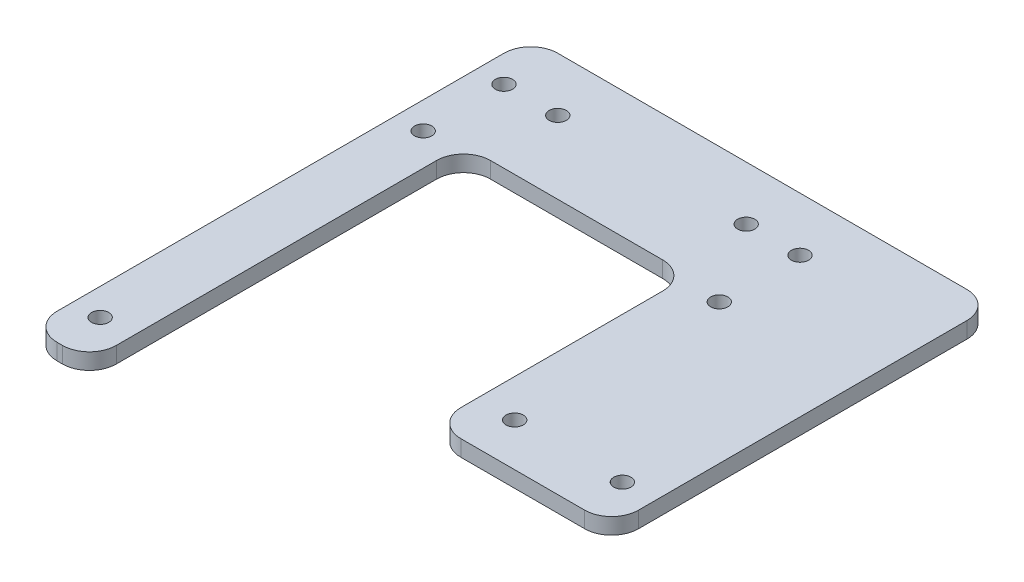
ISO-10303-21;
HEADER;
FILE_DESCRIPTION(('STEP AP214'),'2;1');
FILE_NAME('part.step','',(''),(''),'','','');
FILE_SCHEMA(('AUTOMOTIVE_DESIGN { 1 0 10303 214 1 1 1 1 }'));
ENDSEC;
DATA;
#1=APPLICATION_CONTEXT('core data for automotive mechanical design processes');
#2=APPLICATION_PROTOCOL_DEFINITION('international standard','automotive_design',2000,#1);
#3=PRODUCT_CONTEXT('',#1,'mechanical');
#4=PRODUCT('Part','Part','',(#3));
#5=PRODUCT_RELATED_PRODUCT_CATEGORY('part','',(#4));
#6=PRODUCT_DEFINITION_FORMATION('','',#4);
#7=PRODUCT_DEFINITION_CONTEXT('part definition',#1,'design');
#8=PRODUCT_DEFINITION('design','',#6,#7);
#9=PRODUCT_DEFINITION_SHAPE('','',#8);
#10=(LENGTH_UNIT() NAMED_UNIT(*) SI_UNIT(.MILLI.,.METRE.));
#11=(NAMED_UNIT(*) PLANE_ANGLE_UNIT() SI_UNIT($,.RADIAN.));
#12=(NAMED_UNIT(*) SI_UNIT($,.STERADIAN.) SOLID_ANGLE_UNIT());
#13=UNCERTAINTY_MEASURE_WITH_UNIT(LENGTH_MEASURE(1.E-05),#10,'distance_accuracy_value','');
#14=(GEOMETRIC_REPRESENTATION_CONTEXT(3) GLOBAL_UNCERTAINTY_ASSIGNED_CONTEXT((#13)) GLOBAL_UNIT_ASSIGNED_CONTEXT((#10,
#11,#12)) REPRESENTATION_CONTEXT('',''));
#15=CARTESIAN_POINT('',(0.,0.,0.));
#16=DIRECTION('',(0.,0.,1.));
#17=DIRECTION('',(1.,0.,0.));
#18=AXIS2_PLACEMENT_3D('',#15,#16,#17);
#19=CARTESIAN_POINT('',(-190.,10.,-194.));
#20=DIRECTION('',(0.,0.,1.));
#21=DIRECTION('',(1.,0.,0.));
#22=AXIS2_PLACEMENT_3D('',#19,#20,#21);
#23=PLANE('',#22);
#24=DIRECTION('',(-1.,0.,0.));
#25=VECTOR('',#24,1.);
#26=CARTESIAN_POINT('',(-190.,0.,-194.));
#27=LINE('',#26,#25);
#28=CARTESIAN_POINT('',(-184.,0.,-194.));
#29=VERTEX_POINT('',#28);
#30=CARTESIAN_POINT('',(-185.,0.,-194.));
#31=VERTEX_POINT('',#30);
#32=EDGE_CURVE('E307',#29,#31,#27,.T.);
#33=ORIENTED_EDGE('',*,*,#32,.F.);
#34=DIRECTION('',(0.,-1.,0.));
#35=VECTOR('',#34,1.);
#36=CARTESIAN_POINT('',(-184.,3.,-194.));
#37=LINE('',#36,#35);
#38=CARTESIAN_POINT('',(-184.,3.,-194.));
#39=VERTEX_POINT('',#38);
#40=EDGE_CURVE('E263',#29,#39,#37,.F.);
#41=ORIENTED_EDGE('',*,*,#40,.T.);
#42=DIRECTION('',(-1.,0.,0.));
#43=VECTOR('',#42,1.);
#44=CARTESIAN_POINT('',(0.,3.,-194.));
#45=LINE('',#44,#43);
#46=CARTESIAN_POINT('',(-185.,3.,-194.));
#47=VERTEX_POINT('',#46);
#48=EDGE_CURVE('E309',#39,#47,#45,.T.);
#49=ORIENTED_EDGE('',*,*,#48,.T.);
#50=DIRECTION('',(0.,-1.,0.));
#51=VECTOR('',#50,1.);
#52=CARTESIAN_POINT('',(-185.,0.,-194.));
#53=LINE('',#52,#51);
#54=EDGE_CURVE('E216',#47,#31,#53,.T.);
#55=ORIENTED_EDGE('',*,*,#54,.T.);
#56=EDGE_LOOP('',(#33,#41,#49,#55));
#57=FACE_BOUND('',#56,.T.);
#58=ADVANCED_FACE('F51',(#57),#23,.T.);
#59=CARTESIAN_POINT('',(-190.,3.,-287.));
#60=DIRECTION('',(1.,0.,0.));
#61=DIRECTION('',(0.,0.,-1.));
#62=AXIS2_PLACEMENT_3D('',#59,#60,#61);
#63=PLANE('',#62);
#64=DIRECTION('',(0.,0.,1.));
#65=VECTOR('',#64,1.);
#66=CARTESIAN_POINT('',(-190.,0.,-287.));
#67=LINE('',#66,#65);
#68=CARTESIAN_POINT('',(-190.,0.,-282.));
#69=VERTEX_POINT('',#68);
#70=CARTESIAN_POINT('',(-190.,0.,-199.));
#71=VERTEX_POINT('',#70);
#72=EDGE_CURVE('E178',#69,#71,#67,.T.);
#73=ORIENTED_EDGE('',*,*,#72,.T.);
#74=DIRECTION('',(0.,-1.,0.));
#75=VECTOR('',#74,1.);
#76=CARTESIAN_POINT('',(-190.,3.,-199.));
#77=LINE('',#76,#75);
#78=CARTESIAN_POINT('',(-190.,3.,-199.));
#79=VERTEX_POINT('',#78);
#80=EDGE_CURVE('E219',#71,#79,#77,.F.);
#81=ORIENTED_EDGE('',*,*,#80,.T.);
#82=DIRECTION('',(0.,0.,1.));
#83=VECTOR('',#82,1.);
#84=CARTESIAN_POINT('',(-190.,3.,0.));
#85=LINE('',#84,#83);
#86=CARTESIAN_POINT('',(-190.,3.,-282.));
#87=VERTEX_POINT('',#86);
#88=EDGE_CURVE('E181',#87,#79,#85,.T.);
#89=ORIENTED_EDGE('',*,*,#88,.F.);
#90=DIRECTION('',(0.,-1.,0.));
#91=VECTOR('',#90,1.);
#92=CARTESIAN_POINT('',(-190.,3.,-282.));
#93=LINE('',#92,#91);
#94=EDGE_CURVE('E168',#87,#69,#93,.T.);
#95=ORIENTED_EDGE('',*,*,#94,.T.);
#96=EDGE_LOOP('',(#73,#81,#89,#95));
#97=FACE_BOUND('',#96,.T.);
#98=ADVANCED_FACE('F177',(#97),#63,.F.);
#99=CARTESIAN_POINT('',(0.,3.,0.));
#100=DIRECTION('',(0.,-1.,0.));
#101=DIRECTION('',(0.,0.,-1.));
#102=AXIS2_PLACEMENT_3D('',#99,#100,#101);
#103=PLANE('',#102);
#104=CARTESIAN_POINT('',(-110.,3.,-224.));
#105=DIRECTION('',(0.,-1.,0.));
#106=DIRECTION('',(0.,0.,-1.));
#107=AXIS2_PLACEMENT_3D('',#104,#105,#106);
#108=CIRCLE('',#107,1.59999999999999);
#109=CARTESIAN_POINT('',(-110.,3.,-225.6));
#110=VERTEX_POINT('',#109);
#111=EDGE_CURVE('E366',#110,#110,#108,.T.);
#112=ORIENTED_EDGE('',*,*,#111,.T.);
#113=EDGE_LOOP('',(#112));
#114=FACE_BOUND('',#113,.T.);
#115=CARTESIAN_POINT('',(-130.,3.,-224.));
#116=DIRECTION('',(0.,-1.,0.));
#117=DIRECTION('',(0.,0.,-1.));
#118=AXIS2_PLACEMENT_3D('',#115,#116,#117);
#119=CIRCLE('',#118,1.59999999999999);
#120=CARTESIAN_POINT('',(-130.,3.,-225.6));
#121=VERTEX_POINT('',#120);
#122=EDGE_CURVE('E360',#121,#121,#119,.T.);
#123=ORIENTED_EDGE('',*,*,#122,.T.);
#124=EDGE_LOOP('',(#123));
#125=FACE_BOUND('',#124,.T.);
#126=DIRECTION('',(0.,0.,-1.));
#127=VECTOR('',#126,1.);
#128=CARTESIAN_POINT('',(-104.,3.,0.));
#129=LINE('',#128,#127);
#130=CARTESIAN_POINT('',(-104.,3.,-221.));
#131=VERTEX_POINT('',#130);
#132=CARTESIAN_POINT('',(-104.,3.,-282.));
#133=VERTEX_POINT('',#132);
#134=EDGE_CURVE('E301',#131,#133,#129,.T.);
#135=ORIENTED_EDGE('',*,*,#134,.T.);
#136=CARTESIAN_POINT('',(-109.,3.,-282.));
#137=DIRECTION('',(0.,-1.,0.));
#138=DIRECTION('',(0.,0.,-1.));
#139=AXIS2_PLACEMENT_3D('',#136,#137,#138);
#140=CIRCLE('',#139,5.);
#141=CARTESIAN_POINT('',(-109.,3.,-287.));
#142=VERTEX_POINT('',#141);
#143=EDGE_CURVE('E248',#133,#142,#140,.F.);
#144=ORIENTED_EDGE('',*,*,#143,.T.);
#145=DIRECTION('',(-1.,0.,0.));
#146=VECTOR('',#145,1.);
#147=CARTESIAN_POINT('',(-101.545,3.,-287.));
#148=LINE('',#147,#146);
#149=CARTESIAN_POINT('',(-185.,3.,-287.));
#150=VERTEX_POINT('',#149);
#151=EDGE_CURVE('E182',#142,#150,#148,.T.);
#152=ORIENTED_EDGE('',*,*,#151,.T.);
#153=CARTESIAN_POINT('',(-185.,3.,-282.));
#154=DIRECTION('',(0.,-1.,0.));
#155=DIRECTION('',(0.,0.,-1.));
#156=AXIS2_PLACEMENT_3D('',#153,#154,#155);
#157=CIRCLE('',#156,5.);
#158=EDGE_CURVE('E210',#150,#87,#157,.F.);
#159=ORIENTED_EDGE('',*,*,#158,.T.);
#160=ORIENTED_EDGE('',*,*,#88,.T.);
#161=CARTESIAN_POINT('',(-185.,3.,-199.));
#162=DIRECTION('',(0.,-1.,0.));
#163=DIRECTION('',(0.,0.,-1.));
#164=AXIS2_PLACEMENT_3D('',#161,#162,#163);
#165=CIRCLE('',#164,5.);
#166=EDGE_CURVE('E213',#79,#47,#165,.F.);
#167=ORIENTED_EDGE('',*,*,#166,.T.);
#168=ORIENTED_EDGE('',*,*,#48,.F.);
#169=CARTESIAN_POINT('',(-184.,3.,-199.));
#170=DIRECTION('',(0.,-1.,0.));
#171=DIRECTION('',(0.,0.,-1.));
#172=AXIS2_PLACEMENT_3D('',#169,#170,#171);
#173=CIRCLE('',#172,5.);
#174=CARTESIAN_POINT('',(-179.,3.00000000000001,-199.));
#175=VERTEX_POINT('',#174);
#176=EDGE_CURVE('E242',#39,#175,#173,.F.);
#177=ORIENTED_EDGE('',*,*,#176,.T.);
#178=DIRECTION('',(0.,0.,1.));
#179=VECTOR('',#178,1.);
#180=CARTESIAN_POINT('',(-179.,3.00000000000002,-248.));
#181=LINE('',#180,#179);
#182=CARTESIAN_POINT('',(-179.,3.00000000000002,-258.5));
#183=VERTEX_POINT('',#182);
#184=EDGE_CURVE('E292',#183,#175,#181,.T.);
#185=ORIENTED_EDGE('',*,*,#184,.F.);
#186=CARTESIAN_POINT('',(-174.,3.,-258.5));
#187=DIRECTION('',(0.,-1.,0.));
#188=DIRECTION('',(0.,0.,-1.));
#189=AXIS2_PLACEMENT_3D('',#186,#187,#188);
#190=CIRCLE('',#189,5.);
#191=CARTESIAN_POINT('',(-174.,3.,-263.5));
#192=VERTEX_POINT('',#191);
#193=EDGE_CURVE('E13',#183,#192,#190,.T.);
#194=ORIENTED_EDGE('',*,*,#193,.T.);
#195=DIRECTION('',(1.,0.,0.));
#196=VECTOR('',#195,1.);
#197=CARTESIAN_POINT('',(0.,3.,-263.5));
#198=LINE('',#197,#196);
#199=CARTESIAN_POINT('',(-142.,3.,-263.5));
#200=VERTEX_POINT('',#199);
#201=EDGE_CURVE('E290',#192,#200,#198,.T.);
#202=ORIENTED_EDGE('',*,*,#201,.T.);
#203=CARTESIAN_POINT('',(-142.,3.,-258.5));
#204=DIRECTION('',(0.,-1.,0.));
#205=DIRECTION('',(0.,0.,-1.));
#206=AXIS2_PLACEMENT_3D('',#203,#204,#205);
#207=CIRCLE('',#206,5.);
#208=CARTESIAN_POINT('',(-137.,3.00000000000002,-258.5));
#209=VERTEX_POINT('',#208);
#210=EDGE_CURVE('E267',#200,#209,#207,.T.);
#211=ORIENTED_EDGE('',*,*,#210,.T.);
#212=DIRECTION('',(0.,0.,-1.));
#213=VECTOR('',#212,1.);
#214=CARTESIAN_POINT('',(-137.,3.00000000000002,-248.));
#215=LINE('',#214,#213);
#216=CARTESIAN_POINT('',(-137.,3.00000000000001,-221.));
#217=VERTEX_POINT('',#216);
#218=EDGE_CURVE('E207',#217,#209,#215,.T.);
#219=ORIENTED_EDGE('',*,*,#218,.F.);
#220=CARTESIAN_POINT('',(-132.,3.,-221.));
#221=DIRECTION('',(0.,-1.,0.));
#222=DIRECTION('',(0.,0.,-1.));
#223=AXIS2_PLACEMENT_3D('',#220,#221,#222);
#224=CIRCLE('',#223,5.);
#225=CARTESIAN_POINT('',(-132.,3.,-216.));
#226=VERTEX_POINT('',#225);
#227=EDGE_CURVE('E244',#217,#226,#224,.F.);
#228=ORIENTED_EDGE('',*,*,#227,.T.);
#229=DIRECTION('',(1.,0.,0.));
#230=VECTOR('',#229,1.);
#231=CARTESIAN_POINT('',(0.,3.,-216.));
#232=LINE('',#231,#230);
#233=CARTESIAN_POINT('',(-109.,3.,-216.));
#234=VERTEX_POINT('',#233);
#235=EDGE_CURVE('E354',#226,#234,#232,.T.);
#236=ORIENTED_EDGE('',*,*,#235,.T.);
#237=CARTESIAN_POINT('',(-109.,3.,-221.));
#238=DIRECTION('',(0.,-1.,0.));
#239=DIRECTION('',(0.,0.,-1.));
#240=AXIS2_PLACEMENT_3D('',#237,#238,#239);
#241=CIRCLE('',#240,5.);
#242=EDGE_CURVE('E246',#234,#131,#241,.F.);
#243=ORIENTED_EDGE('',*,*,#242,.T.);
#244=EDGE_LOOP('',(#135,#144,#152,#159,#160,#167,#168,#177,#185,#194,#202,#211,#219,#228,#236,#243));
#245=FACE_BOUND('',#244,.T.);
#246=CARTESIAN_POINT('',(-185.,3.,-202.));
#247=DIRECTION('',(0.,-1.,0.));
#248=DIRECTION('',(0.,0.,-1.));
#249=AXIS2_PLACEMENT_3D('',#246,#247,#248);
#250=CIRCLE('',#249,1.59999999999999);
#251=CARTESIAN_POINT('',(-185.,3.,-203.6));
#252=VERTEX_POINT('',#251);
#253=EDGE_CURVE('E299',#252,#252,#250,.T.);
#254=ORIENTED_EDGE('',*,*,#253,.T.);
#255=EDGE_LOOP('',(#254));
#256=FACE_BOUND('',#255,.T.);
#257=CARTESIAN_POINT('',(-130.,3.00000000000002,-262.));
#258=DIRECTION('',(0.,1.,0.));
#259=DIRECTION('',(0.,0.,-1.));
#260=AXIS2_PLACEMENT_3D('',#257,#258,#259);
#261=CIRCLE('',#260,1.59999999999996);
#262=CARTESIAN_POINT('',(-130.,3.00000000000002,-263.6));
#263=VERTEX_POINT('',#262);
#264=EDGE_CURVE('E199',#263,#263,#261,.T.);
#265=ORIENTED_EDGE('',*,*,#264,.F.);
#266=EDGE_LOOP('',(#265));
#267=FACE_BOUND('',#266,.T.);
#268=CARTESIAN_POINT('',(-130.,3.00000000000002,-277.));
#269=DIRECTION('',(0.,1.,0.));
#270=DIRECTION('',(0.,0.,-1.));
#271=AXIS2_PLACEMENT_3D('',#268,#269,#270);
#272=CIRCLE('',#271,1.59999999999996);
#273=CARTESIAN_POINT('',(-130.,3.00000000000002,-278.6));
#274=VERTEX_POINT('',#273);
#275=EDGE_CURVE('E327',#274,#274,#272,.T.);
#276=ORIENTED_EDGE('',*,*,#275,.F.);
#277=EDGE_LOOP('',(#276));
#278=FACE_BOUND('',#277,.T.);
#279=CARTESIAN_POINT('',(-185.,3.00000000000002,-277.));
#280=DIRECTION('',(0.,1.,0.));
#281=DIRECTION('',(0.,0.,1.));
#282=AXIS2_PLACEMENT_3D('',#279,#280,#281);
#283=CIRCLE('',#282,1.59999999999999);
#284=CARTESIAN_POINT('',(-185.,3.00000000000002,-275.4));
#285=VERTEX_POINT('',#284);
#286=EDGE_CURVE('E324',#285,#285,#283,.T.);
#287=ORIENTED_EDGE('',*,*,#286,.F.);
#288=EDGE_LOOP('',(#287));
#289=FACE_BOUND('',#288,.T.);
#290=CARTESIAN_POINT('',(-185.,3.00000000000002,-262.));
#291=DIRECTION('',(0.,1.,0.));
#292=DIRECTION('',(0.,0.,1.));
#293=AXIS2_PLACEMENT_3D('',#290,#291,#292);
#294=CIRCLE('',#293,1.59999999999999);
#295=CARTESIAN_POINT('',(-185.,3.00000000000002,-260.4));
#296=VERTEX_POINT('',#295);
#297=EDGE_CURVE('E321',#296,#296,#294,.T.);
#298=ORIENTED_EDGE('',*,*,#297,.F.);
#299=EDGE_LOOP('',(#298));
#300=FACE_BOUND('',#299,.T.);
#301=CARTESIAN_POINT('',(-140.,3.,-277.));
#302=DIRECTION('',(0.,1.,0.));
#303=DIRECTION('',(0.,0.,-1.));
#304=AXIS2_PLACEMENT_3D('',#301,#302,#303);
#305=CIRCLE('',#304,1.60000000000002);
#306=CARTESIAN_POINT('',(-140.,3.,-278.6));
#307=VERTEX_POINT('',#306);
#308=EDGE_CURVE('E311',#307,#307,#305,.T.);
#309=ORIENTED_EDGE('',*,*,#308,.F.);
#310=EDGE_LOOP('',(#309));
#311=FACE_BOUND('',#310,.T.);
#312=CARTESIAN_POINT('',(-175.,3.,-277.));
#313=DIRECTION('',(0.,1.,0.));
#314=DIRECTION('',(0.,0.,-1.));
#315=AXIS2_PLACEMENT_3D('',#312,#313,#314);
#316=CIRCLE('',#315,1.60000000000002);
#317=CARTESIAN_POINT('',(-175.,3.,-278.6));
#318=VERTEX_POINT('',#317);
#319=EDGE_CURVE('E315',#318,#318,#316,.T.);
#320=ORIENTED_EDGE('',*,*,#319,.F.);
#321=EDGE_LOOP('',(#320));
#322=FACE_BOUND('',#321,.T.);
#323=ADVANCED_FACE('F288',(#114,#125,#245,#256,#267,#278,#289,#300,#311,#322),#103,.F.);
#324=CARTESIAN_POINT('',(0.,0.,0.));
#325=DIRECTION('',(0.,-1.,0.));
#326=DIRECTION('',(0.,0.,-1.));
#327=AXIS2_PLACEMENT_3D('',#324,#325,#326);
#328=PLANE('',#327);
#329=CARTESIAN_POINT('',(-110.,0.,-224.));
#330=DIRECTION('',(0.,-1.,0.));
#331=DIRECTION('',(0.,0.,-1.));
#332=AXIS2_PLACEMENT_3D('',#329,#330,#331);
#333=CIRCLE('',#332,1.59999999999999);
#334=CARTESIAN_POINT('',(-110.,0.,-225.6));
#335=VERTEX_POINT('',#334);
#336=EDGE_CURVE('E369',#335,#335,#333,.T.);
#337=ORIENTED_EDGE('',*,*,#336,.F.);
#338=EDGE_LOOP('',(#337));
#339=FACE_BOUND('',#338,.T.);
#340=CARTESIAN_POINT('',(-130.,0.,-224.));
#341=DIRECTION('',(0.,-1.,0.));
#342=DIRECTION('',(0.,0.,-1.));
#343=AXIS2_PLACEMENT_3D('',#340,#341,#342);
#344=CIRCLE('',#343,1.59999999999999);
#345=CARTESIAN_POINT('',(-130.,0.,-225.6));
#346=VERTEX_POINT('',#345);
#347=EDGE_CURVE('E363',#346,#346,#344,.T.);
#348=ORIENTED_EDGE('',*,*,#347,.F.);
#349=EDGE_LOOP('',(#348));
#350=FACE_BOUND('',#349,.T.);
#351=DIRECTION('',(-1.,0.,0.));
#352=VECTOR('',#351,1.);
#353=CARTESIAN_POINT('',(-101.545,0.,-287.));
#354=LINE('',#353,#352);
#355=CARTESIAN_POINT('',(-109.,0.,-287.));
#356=VERTEX_POINT('',#355);
#357=CARTESIAN_POINT('',(-185.,0.,-287.));
#358=VERTEX_POINT('',#357);
#359=EDGE_CURVE('E188',#356,#358,#354,.T.);
#360=ORIENTED_EDGE('',*,*,#359,.F.);
#361=CARTESIAN_POINT('',(-109.,0.,-282.));
#362=DIRECTION('',(0.,-1.,0.));
#363=DIRECTION('',(0.,0.,-1.));
#364=AXIS2_PLACEMENT_3D('',#361,#362,#363);
#365=CIRCLE('',#364,5.);
#366=CARTESIAN_POINT('',(-104.,0.,-282.));
#367=VERTEX_POINT('',#366);
#368=EDGE_CURVE('E256',#356,#367,#365,.T.);
#369=ORIENTED_EDGE('',*,*,#368,.T.);
#370=DIRECTION('',(0.,0.,-1.));
#371=VECTOR('',#370,1.);
#372=CARTESIAN_POINT('',(-104.,0.,-194.));
#373=LINE('',#372,#371);
#374=CARTESIAN_POINT('',(-104.,0.,-221.));
#375=VERTEX_POINT('',#374);
#376=EDGE_CURVE('E351',#375,#367,#373,.T.);
#377=ORIENTED_EDGE('',*,*,#376,.F.);
#378=CARTESIAN_POINT('',(-109.,0.,-221.));
#379=DIRECTION('',(0.,-1.,0.));
#380=DIRECTION('',(0.,0.,-1.));
#381=AXIS2_PLACEMENT_3D('',#378,#379,#380);
#382=CIRCLE('',#381,5.);
#383=CARTESIAN_POINT('',(-109.,0.,-216.));
#384=VERTEX_POINT('',#383);
#385=EDGE_CURVE('E73',#375,#384,#382,.T.);
#386=ORIENTED_EDGE('',*,*,#385,.T.);
#387=DIRECTION('',(1.,0.,0.));
#388=VECTOR('',#387,1.);
#389=CARTESIAN_POINT('',(-104.,0.,-216.));
#390=LINE('',#389,#388);
#391=CARTESIAN_POINT('',(-132.,0.,-216.));
#392=VERTEX_POINT('',#391);
#393=EDGE_CURVE('E358',#392,#384,#390,.T.);
#394=ORIENTED_EDGE('',*,*,#393,.F.);
#395=CARTESIAN_POINT('',(-132.,0.,-221.));
#396=DIRECTION('',(0.,-1.,0.));
#397=DIRECTION('',(0.,0.,-1.));
#398=AXIS2_PLACEMENT_3D('',#395,#396,#397);
#399=CIRCLE('',#398,5.);
#400=CARTESIAN_POINT('',(-137.,0.,-221.));
#401=VERTEX_POINT('',#400);
#402=EDGE_CURVE('E253',#392,#401,#399,.T.);
#403=ORIENTED_EDGE('',*,*,#402,.T.);
#404=DIRECTION('',(0.,0.,-1.));
#405=VECTOR('',#404,1.);
#406=CARTESIAN_POINT('',(-137.,0.,-248.));
#407=LINE('',#406,#405);
#408=CARTESIAN_POINT('',(-137.,0.,-258.5));
#409=VERTEX_POINT('',#408);
#410=EDGE_CURVE('E280',#401,#409,#407,.T.);
#411=ORIENTED_EDGE('',*,*,#410,.T.);
#412=CARTESIAN_POINT('',(-142.,0.,-258.5));
#413=DIRECTION('',(0.,-1.,0.));
#414=DIRECTION('',(0.,0.,-1.));
#415=AXIS2_PLACEMENT_3D('',#412,#413,#414);
#416=CIRCLE('',#415,5.);
#417=CARTESIAN_POINT('',(-142.,0.,-263.5));
#418=VERTEX_POINT('',#417);
#419=EDGE_CURVE('E265',#409,#418,#416,.F.);
#420=ORIENTED_EDGE('',*,*,#419,.T.);
#421=DIRECTION('',(1.,0.,0.));
#422=VECTOR('',#421,1.);
#423=CARTESIAN_POINT('',(-166.,0.,-263.5));
#424=LINE('',#423,#422);
#425=CARTESIAN_POINT('',(-174.,0.,-263.5));
#426=VERTEX_POINT('',#425);
#427=EDGE_CURVE('E271',#426,#418,#424,.T.);
#428=ORIENTED_EDGE('',*,*,#427,.F.);
#429=CARTESIAN_POINT('',(-174.,0.,-258.5));
#430=DIRECTION('',(0.,-1.,0.));
#431=DIRECTION('',(0.,0.,-1.));
#432=AXIS2_PLACEMENT_3D('',#429,#430,#431);
#433=CIRCLE('',#432,5.);
#434=CARTESIAN_POINT('',(-179.,0.,-258.5));
#435=VERTEX_POINT('',#434);
#436=EDGE_CURVE('E59',#426,#435,#433,.F.);
#437=ORIENTED_EDGE('',*,*,#436,.T.);
#438=DIRECTION('',(0.,0.,1.));
#439=VECTOR('',#438,1.);
#440=CARTESIAN_POINT('',(-179.,0.,-248.));
#441=LINE('',#440,#439);
#442=CARTESIAN_POINT('',(-179.,0.,-199.));
#443=VERTEX_POINT('',#442);
#444=EDGE_CURVE('E191',#435,#443,#441,.T.);
#445=ORIENTED_EDGE('',*,*,#444,.T.);
#446=CARTESIAN_POINT('',(-184.,0.,-199.));
#447=DIRECTION('',(0.,-1.,0.));
#448=DIRECTION('',(0.,0.,-1.));
#449=AXIS2_PLACEMENT_3D('',#446,#447,#448);
#450=CIRCLE('',#449,5.);
#451=EDGE_CURVE('E66',#443,#29,#450,.T.);
#452=ORIENTED_EDGE('',*,*,#451,.T.);
#453=ORIENTED_EDGE('',*,*,#32,.T.);
#454=CARTESIAN_POINT('',(-185.,0.,-199.));
#455=DIRECTION('',(0.,-1.,0.));
#456=DIRECTION('',(0.,0.,-1.));
#457=AXIS2_PLACEMENT_3D('',#454,#455,#456);
#458=CIRCLE('',#457,5.);
#459=EDGE_CURVE('E187',#31,#71,#458,.T.);
#460=ORIENTED_EDGE('',*,*,#459,.T.);
#461=ORIENTED_EDGE('',*,*,#72,.F.);
#462=CARTESIAN_POINT('',(-185.,0.,-282.));
#463=DIRECTION('',(0.,-1.,0.));
#464=DIRECTION('',(0.,0.,-1.));
#465=AXIS2_PLACEMENT_3D('',#462,#463,#464);
#466=CIRCLE('',#465,5.);
#467=EDGE_CURVE('E164',#69,#358,#466,.T.);
#468=ORIENTED_EDGE('',*,*,#467,.T.);
#469=EDGE_LOOP('',(#360,#369,#377,#386,#394,#403,#411,#420,#428,#437,#445,#452,#453,#460,#461,#468));
#470=FACE_BOUND('',#469,.T.);
#471=CARTESIAN_POINT('',(-185.,0.,-202.));
#472=DIRECTION('',(0.,-1.,0.));
#473=DIRECTION('',(0.,0.,-1.));
#474=AXIS2_PLACEMENT_3D('',#471,#472,#473);
#475=CIRCLE('',#474,1.59999999999999);
#476=CARTESIAN_POINT('',(-185.,0.,-203.6));
#477=VERTEX_POINT('',#476);
#478=EDGE_CURVE('E296',#477,#477,#475,.T.);
#479=ORIENTED_EDGE('',*,*,#478,.F.);
#480=EDGE_LOOP('',(#479));
#481=FACE_BOUND('',#480,.T.);
#482=CARTESIAN_POINT('',(-130.,0.,-262.));
#483=DIRECTION('',(0.,-1.,0.));
#484=DIRECTION('',(0.,0.,-1.));
#485=AXIS2_PLACEMENT_3D('',#482,#483,#484);
#486=CIRCLE('',#485,1.59999999999996);
#487=CARTESIAN_POINT('',(-130.,0.,-263.6));
#488=VERTEX_POINT('',#487);
#489=EDGE_CURVE('E195',#488,#488,#486,.T.);
#490=ORIENTED_EDGE('',*,*,#489,.F.);
#491=EDGE_LOOP('',(#490));
#492=FACE_BOUND('',#491,.T.);
#493=CARTESIAN_POINT('',(-130.,0.,-277.));
#494=DIRECTION('',(0.,-1.,0.));
#495=DIRECTION('',(0.,0.,-1.));
#496=AXIS2_PLACEMENT_3D('',#493,#494,#495);
#497=CIRCLE('',#496,1.59999999999996);
#498=CARTESIAN_POINT('',(-130.,0.,-278.6));
#499=VERTEX_POINT('',#498);
#500=EDGE_CURVE('E198',#499,#499,#497,.T.);
#501=ORIENTED_EDGE('',*,*,#500,.F.);
#502=EDGE_LOOP('',(#501));
#503=FACE_BOUND('',#502,.T.);
#504=CARTESIAN_POINT('',(-185.,0.,-277.));
#505=DIRECTION('',(0.,-1.,0.));
#506=DIRECTION('',(0.,0.,-1.));
#507=AXIS2_PLACEMENT_3D('',#504,#505,#506);
#508=CIRCLE('',#507,1.59999999999999);
#509=CARTESIAN_POINT('',(-185.,0.,-278.6));
#510=VERTEX_POINT('',#509);
#511=EDGE_CURVE('E202',#510,#510,#508,.T.);
#512=ORIENTED_EDGE('',*,*,#511,.F.);
#513=EDGE_LOOP('',(#512));
#514=FACE_BOUND('',#513,.T.);
#515=CARTESIAN_POINT('',(-185.,0.,-262.));
#516=DIRECTION('',(0.,-1.,0.));
#517=DIRECTION('',(0.,0.,-1.));
#518=AXIS2_PLACEMENT_3D('',#515,#516,#517);
#519=CIRCLE('',#518,1.59999999999999);
#520=CARTESIAN_POINT('',(-185.,0.,-263.6));
#521=VERTEX_POINT('',#520);
#522=EDGE_CURVE('E205',#521,#521,#519,.T.);
#523=ORIENTED_EDGE('',*,*,#522,.F.);
#524=EDGE_LOOP('',(#523));
#525=FACE_BOUND('',#524,.T.);
#526=CARTESIAN_POINT('',(-140.,0.,-277.));
#527=DIRECTION('',(0.,1.,0.));
#528=DIRECTION('',(0.,0.,-1.));
#529=AXIS2_PLACEMENT_3D('',#526,#527,#528);
#530=CIRCLE('',#529,1.60000000000002);
#531=CARTESIAN_POINT('',(-140.,0.,-278.6));
#532=VERTEX_POINT('',#531);
#533=EDGE_CURVE('E312',#532,#532,#530,.T.);
#534=ORIENTED_EDGE('',*,*,#533,.T.);
#535=EDGE_LOOP('',(#534));
#536=FACE_BOUND('',#535,.T.);
#537=CARTESIAN_POINT('',(-175.,0.,-277.));
#538=DIRECTION('',(0.,1.,0.));
#539=DIRECTION('',(0.,0.,-1.));
#540=AXIS2_PLACEMENT_3D('',#537,#538,#539);
#541=CIRCLE('',#540,1.60000000000002);
#542=CARTESIAN_POINT('',(-175.,0.,-278.6));
#543=VERTEX_POINT('',#542);
#544=EDGE_CURVE('E318',#543,#543,#541,.T.);
#545=ORIENTED_EDGE('',*,*,#544,.T.);
#546=EDGE_LOOP('',(#545));
#547=FACE_BOUND('',#546,.T.);
#548=ADVANCED_FACE('F184',(#339,#350,#470,#481,#492,#503,#514,#525,#536,#547),#328,.T.);
#549=CARTESIAN_POINT('',(-101.545,3.,-287.));
#550=DIRECTION('',(0.,0.,1.));
#551=DIRECTION('',(1.,0.,0.));
#552=AXIS2_PLACEMENT_3D('',#549,#550,#551);
#553=PLANE('',#552);
#554=ORIENTED_EDGE('',*,*,#151,.F.);
#555=DIRECTION('',(0.,1.,0.));
#556=VECTOR('',#555,1.);
#557=CARTESIAN_POINT('',(-109.,3.,-287.));
#558=LINE('',#557,#556);
#559=EDGE_CURVE('E250',#142,#356,#558,.F.);
#560=ORIENTED_EDGE('',*,*,#559,.T.);
#561=ORIENTED_EDGE('',*,*,#359,.T.);
#562=DIRECTION('',(0.,-1.,0.));
#563=VECTOR('',#562,1.);
#564=CARTESIAN_POINT('',(-185.,3.,-287.));
#565=LINE('',#564,#563);
#566=EDGE_CURVE('E170',#358,#150,#565,.F.);
#567=ORIENTED_EDGE('',*,*,#566,.T.);
#568=EDGE_LOOP('',(#554,#560,#561,#567));
#569=FACE_BOUND('',#568,.T.);
#570=ADVANCED_FACE('F341',(#569),#553,.F.);
#571=CARTESIAN_POINT('',(-137.,0.,-248.));
#572=DIRECTION('',(1.,0.,0.));
#573=DIRECTION('',(0.,0.,-1.));
#574=AXIS2_PLACEMENT_3D('',#571,#572,#573);
#575=PLANE('',#574);
#576=ORIENTED_EDGE('',*,*,#218,.T.);
#577=DIRECTION('',(0.,-1.,0.));
#578=VECTOR('',#577,1.);
#579=CARTESIAN_POINT('',(-137.,0.,-258.5));
#580=LINE('',#579,#578);
#581=EDGE_CURVE('E223',#209,#409,#580,.T.);
#582=ORIENTED_EDGE('',*,*,#581,.T.);
#583=ORIENTED_EDGE('',*,*,#410,.F.);
#584=DIRECTION('',(0.,-1.,0.));
#585=VECTOR('',#584,1.);
#586=CARTESIAN_POINT('',(-137.,0.,-221.));
#587=LINE('',#586,#585);
#588=EDGE_CURVE('E221',#401,#217,#587,.F.);
#589=ORIENTED_EDGE('',*,*,#588,.T.);
#590=EDGE_LOOP('',(#576,#582,#583,#589));
#591=FACE_BOUND('',#590,.T.);
#592=ADVANCED_FACE('F429',(#591),#575,.F.);
#593=CARTESIAN_POINT('',(-179.,0.,-248.));
#594=DIRECTION('',(-1.,0.,0.));
#595=DIRECTION('',(0.,0.,1.));
#596=AXIS2_PLACEMENT_3D('',#593,#594,#595);
#597=PLANE('',#596);
#598=ORIENTED_EDGE('',*,*,#444,.F.);
#599=DIRECTION('',(0.,-1.,0.));
#600=VECTOR('',#599,1.);
#601=CARTESIAN_POINT('',(-179.,3.,-258.5));
#602=LINE('',#601,#600);
#603=EDGE_CURVE('E234',#435,#183,#602,.F.);
#604=ORIENTED_EDGE('',*,*,#603,.T.);
#605=ORIENTED_EDGE('',*,*,#184,.T.);
#606=DIRECTION('',(0.,-1.,0.));
#607=VECTOR('',#606,1.);
#608=CARTESIAN_POINT('',(-179.,0.,-199.));
#609=LINE('',#608,#607);
#610=EDGE_CURVE('E231',#175,#443,#609,.T.);
#611=ORIENTED_EDGE('',*,*,#610,.T.);
#612=EDGE_LOOP('',(#598,#604,#605,#611));
#613=FACE_BOUND('',#612,.T.);
#614=ADVANCED_FACE('F276',(#613),#597,.F.);
#615=CARTESIAN_POINT('',(-130.,-6.99999999999998,-262.));
#616=DIRECTION('',(0.,1.,0.));
#617=DIRECTION('',(0.,0.,1.));
#618=AXIS2_PLACEMENT_3D('',#615,#616,#617);
#619=CYLINDRICAL_SURFACE('',#618,1.59999999999996);
#620=ORIENTED_EDGE('',*,*,#489,.T.);
#621=EDGE_LOOP('',(#620));
#622=FACE_BOUND('',#621,.T.);
#623=ORIENTED_EDGE('',*,*,#264,.T.);
#624=EDGE_LOOP('',(#623));
#625=FACE_BOUND('',#624,.T.);
#626=ADVANCED_FACE('F421',(#622,#625),#619,.F.);
#627=CARTESIAN_POINT('',(-130.,-6.99999999999998,-277.));
#628=DIRECTION('',(0.,1.,0.));
#629=DIRECTION('',(0.,0.,1.));
#630=AXIS2_PLACEMENT_3D('',#627,#628,#629);
#631=CYLINDRICAL_SURFACE('',#630,1.59999999999996);
#632=ORIENTED_EDGE('',*,*,#500,.T.);
#633=EDGE_LOOP('',(#632));
#634=FACE_BOUND('',#633,.T.);
#635=ORIENTED_EDGE('',*,*,#275,.T.);
#636=EDGE_LOOP('',(#635));
#637=FACE_BOUND('',#636,.T.);
#638=ADVANCED_FACE('F416',(#634,#637),#631,.F.);
#639=CARTESIAN_POINT('',(-185.,-6.99999999999998,-277.));
#640=DIRECTION('',(0.,1.,0.));
#641=DIRECTION('',(0.,0.,1.));
#642=AXIS2_PLACEMENT_3D('',#639,#640,#641);
#643=CYLINDRICAL_SURFACE('',#642,1.59999999999999);
#644=ORIENTED_EDGE('',*,*,#511,.T.);
#645=EDGE_LOOP('',(#644));
#646=FACE_BOUND('',#645,.T.);
#647=ORIENTED_EDGE('',*,*,#286,.T.);
#648=EDGE_LOOP('',(#647));
#649=FACE_BOUND('',#648,.T.);
#650=ADVANCED_FACE('F413',(#646,#649),#643,.F.);
#651=CARTESIAN_POINT('',(-185.,-6.99999999999998,-262.));
#652=DIRECTION('',(0.,1.,0.));
#653=DIRECTION('',(0.,0.,1.));
#654=AXIS2_PLACEMENT_3D('',#651,#652,#653);
#655=CYLINDRICAL_SURFACE('',#654,1.59999999999999);
#656=ORIENTED_EDGE('',*,*,#522,.T.);
#657=EDGE_LOOP('',(#656));
#658=FACE_BOUND('',#657,.T.);
#659=ORIENTED_EDGE('',*,*,#297,.T.);
#660=EDGE_LOOP('',(#659));
#661=FACE_BOUND('',#660,.T.);
#662=ADVANCED_FACE('F408',(#658,#661),#655,.F.);
#663=CARTESIAN_POINT('',(-140.,0.,-277.));
#664=DIRECTION('',(0.,1.,0.));
#665=DIRECTION('',(0.,0.,1.));
#666=AXIS2_PLACEMENT_3D('',#663,#664,#665);
#667=CYLINDRICAL_SURFACE('',#666,1.60000000000002);
#668=ORIENTED_EDGE('',*,*,#533,.F.);
#669=EDGE_LOOP('',(#668));
#670=FACE_BOUND('',#669,.T.);
#671=ORIENTED_EDGE('',*,*,#308,.T.);
#672=EDGE_LOOP('',(#671));
#673=FACE_BOUND('',#672,.T.);
#674=ADVANCED_FACE('F404',(#670,#673),#667,.F.);
#675=CARTESIAN_POINT('',(-175.,0.,-277.));
#676=DIRECTION('',(0.,1.,0.));
#677=DIRECTION('',(0.,0.,1.));
#678=AXIS2_PLACEMENT_3D('',#675,#676,#677);
#679=CYLINDRICAL_SURFACE('',#678,1.60000000000002);
#680=ORIENTED_EDGE('',*,*,#544,.F.);
#681=EDGE_LOOP('',(#680));
#682=FACE_BOUND('',#681,.T.);
#683=ORIENTED_EDGE('',*,*,#319,.T.);
#684=EDGE_LOOP('',(#683));
#685=FACE_BOUND('',#684,.T.);
#686=ADVANCED_FACE('F407',(#682,#685),#679,.F.);
#687=CARTESIAN_POINT('',(-185.,3.,-282.));
#688=DIRECTION('',(0.,-1.,0.));
#689=DIRECTION('',(0.,0.,-1.));
#690=AXIS2_PLACEMENT_3D('',#687,#688,#689);
#691=CYLINDRICAL_SURFACE('',#690,5.);
#692=ORIENTED_EDGE('',*,*,#158,.F.);
#693=ORIENTED_EDGE('',*,*,#566,.F.);
#694=ORIENTED_EDGE('',*,*,#467,.F.);
#695=ORIENTED_EDGE('',*,*,#94,.F.);
#696=EDGE_LOOP('',(#692,#693,#694,#695));
#697=FACE_BOUND('',#696,.T.);
#698=ADVANCED_FACE('F167',(#697),#691,.T.);
#699=CARTESIAN_POINT('',(-185.,10.,-199.));
#700=DIRECTION('',(0.,1.,0.));
#701=DIRECTION('',(0.,0.,1.));
#702=AXIS2_PLACEMENT_3D('',#699,#700,#701);
#703=CYLINDRICAL_SURFACE('',#702,5.);
#704=ORIENTED_EDGE('',*,*,#166,.F.);
#705=ORIENTED_EDGE('',*,*,#80,.F.);
#706=ORIENTED_EDGE('',*,*,#459,.F.);
#707=ORIENTED_EDGE('',*,*,#54,.F.);
#708=EDGE_LOOP('',(#704,#705,#706,#707));
#709=FACE_BOUND('',#708,.T.);
#710=ADVANCED_FACE('F464',(#709),#703,.T.);
#711=CARTESIAN_POINT('',(-185.,10.,-202.));
#712=DIRECTION('',(0.,-1.,0.));
#713=DIRECTION('',(0.,0.,-1.));
#714=AXIS2_PLACEMENT_3D('',#711,#712,#713);
#715=CYLINDRICAL_SURFACE('',#714,1.59999999999999);
#716=ORIENTED_EDGE('',*,*,#478,.T.);
#717=EDGE_LOOP('',(#716));
#718=FACE_BOUND('',#717,.T.);
#719=ORIENTED_EDGE('',*,*,#253,.F.);
#720=EDGE_LOOP('',(#719));
#721=FACE_BOUND('',#720,.T.);
#722=ADVANCED_FACE('F402',(#718,#721),#715,.F.);
#723=CARTESIAN_POINT('',(-166.,10.,-263.5));
#724=DIRECTION('',(0.,0.,-1.));
#725=DIRECTION('',(-1.,0.,0.));
#726=AXIS2_PLACEMENT_3D('',#723,#724,#725);
#727=PLANE('',#726);
#728=ORIENTED_EDGE('',*,*,#427,.T.);
#729=DIRECTION('',(0.,-1.,0.));
#730=VECTOR('',#729,1.);
#731=CARTESIAN_POINT('',(-142.,3.,-263.5));
#732=LINE('',#731,#730);
#733=EDGE_CURVE('E229',#418,#200,#732,.F.);
#734=ORIENTED_EDGE('',*,*,#733,.T.);
#735=ORIENTED_EDGE('',*,*,#201,.F.);
#736=DIRECTION('',(0.,-1.,0.));
#737=VECTOR('',#736,1.);
#738=CARTESIAN_POINT('',(-174.,0.,-263.5));
#739=LINE('',#738,#737);
#740=EDGE_CURVE('E226',#192,#426,#739,.T.);
#741=ORIENTED_EDGE('',*,*,#740,.T.);
#742=EDGE_LOOP('',(#728,#734,#735,#741));
#743=FACE_BOUND('',#742,.T.);
#744=ADVANCED_FACE('F294',(#743),#727,.F.);
#745=CARTESIAN_POINT('',(-104.,10.,-194.));
#746=DIRECTION('',(-1.,0.,0.));
#747=DIRECTION('',(0.,0.,1.));
#748=AXIS2_PLACEMENT_3D('',#745,#746,#747);
#749=PLANE('',#748);
#750=ORIENTED_EDGE('',*,*,#376,.T.);
#751=DIRECTION('',(0.,1.,0.));
#752=VECTOR('',#751,1.);
#753=CARTESIAN_POINT('',(-104.,10.,-282.));
#754=LINE('',#753,#752);
#755=EDGE_CURVE('E239',#367,#133,#754,.T.);
#756=ORIENTED_EDGE('',*,*,#755,.T.);
#757=ORIENTED_EDGE('',*,*,#134,.F.);
#758=DIRECTION('',(0.,-1.,0.));
#759=VECTOR('',#758,1.);
#760=CARTESIAN_POINT('',(-104.,10.,-221.));
#761=LINE('',#760,#759);
#762=EDGE_CURVE('E236',#131,#375,#761,.T.);
#763=ORIENTED_EDGE('',*,*,#762,.T.);
#764=EDGE_LOOP('',(#750,#756,#757,#763));
#765=FACE_BOUND('',#764,.T.);
#766=ADVANCED_FACE('F349',(#765),#749,.F.);
#767=CARTESIAN_POINT('',(-104.,10.,-216.));
#768=DIRECTION('',(0.,0.,-1.));
#769=DIRECTION('',(-1.,0.,0.));
#770=AXIS2_PLACEMENT_3D('',#767,#768,#769);
#771=PLANE('',#770);
#772=ORIENTED_EDGE('',*,*,#393,.T.);
#773=DIRECTION('',(0.,-1.,0.));
#774=VECTOR('',#773,1.);
#775=CARTESIAN_POINT('',(-109.,10.,-216.));
#776=LINE('',#775,#774);
#777=EDGE_CURVE('E261',#384,#234,#776,.F.);
#778=ORIENTED_EDGE('',*,*,#777,.T.);
#779=ORIENTED_EDGE('',*,*,#235,.F.);
#780=DIRECTION('',(0.,-1.,0.));
#781=VECTOR('',#780,1.);
#782=CARTESIAN_POINT('',(-132.,10.,-216.));
#783=LINE('',#782,#781);
#784=EDGE_CURVE('E258',#226,#392,#783,.T.);
#785=ORIENTED_EDGE('',*,*,#784,.T.);
#786=EDGE_LOOP('',(#772,#778,#779,#785));
#787=FACE_BOUND('',#786,.T.);
#788=ADVANCED_FACE('F448',(#787),#771,.F.);
#789=CARTESIAN_POINT('',(-142.,0.,-258.5));
#790=DIRECTION('',(0.,1.,0.));
#791=DIRECTION('',(0.,0.,1.));
#792=AXIS2_PLACEMENT_3D('',#789,#790,#791);
#793=CYLINDRICAL_SURFACE('',#792,5.);
#794=ORIENTED_EDGE('',*,*,#210,.F.);
#795=ORIENTED_EDGE('',*,*,#733,.F.);
#796=ORIENTED_EDGE('',*,*,#419,.F.);
#797=ORIENTED_EDGE('',*,*,#581,.F.);
#798=EDGE_LOOP('',(#794,#795,#796,#797));
#799=FACE_BOUND('',#798,.T.);
#800=ADVANCED_FACE('F442',(#799),#793,.F.);
#801=CARTESIAN_POINT('',(-174.,10.,-258.5));
#802=DIRECTION('',(0.,1.,0.));
#803=DIRECTION('',(0.,0.,1.));
#804=AXIS2_PLACEMENT_3D('',#801,#802,#803);
#805=CYLINDRICAL_SURFACE('',#804,5.);
#806=ORIENTED_EDGE('',*,*,#193,.F.);
#807=ORIENTED_EDGE('',*,*,#603,.F.);
#808=ORIENTED_EDGE('',*,*,#436,.F.);
#809=ORIENTED_EDGE('',*,*,#740,.F.);
#810=EDGE_LOOP('',(#806,#807,#808,#809));
#811=FACE_BOUND('',#810,.T.);
#812=ADVANCED_FACE('F283',(#811),#805,.F.);
#813=CARTESIAN_POINT('',(-109.,10.,-282.));
#814=DIRECTION('',(0.,1.,0.));
#815=DIRECTION('',(0.,0.,1.));
#816=AXIS2_PLACEMENT_3D('',#813,#814,#815);
#817=CYLINDRICAL_SURFACE('',#816,5.);
#818=ORIENTED_EDGE('',*,*,#368,.F.);
#819=ORIENTED_EDGE('',*,*,#559,.F.);
#820=ORIENTED_EDGE('',*,*,#143,.F.);
#821=ORIENTED_EDGE('',*,*,#755,.F.);
#822=EDGE_LOOP('',(#818,#819,#820,#821));
#823=FACE_BOUND('',#822,.T.);
#824=ADVANCED_FACE('F346',(#823),#817,.T.);
#825=CARTESIAN_POINT('',(-109.,10.,-221.));
#826=DIRECTION('',(0.,-1.,0.));
#827=DIRECTION('',(0.,0.,-1.));
#828=AXIS2_PLACEMENT_3D('',#825,#826,#827);
#829=CYLINDRICAL_SURFACE('',#828,5.);
#830=ORIENTED_EDGE('',*,*,#242,.F.);
#831=ORIENTED_EDGE('',*,*,#777,.F.);
#832=ORIENTED_EDGE('',*,*,#385,.F.);
#833=ORIENTED_EDGE('',*,*,#762,.F.);
#834=EDGE_LOOP('',(#830,#831,#832,#833));
#835=FACE_BOUND('',#834,.T.);
#836=ADVANCED_FACE('F451',(#835),#829,.T.);
#837=CARTESIAN_POINT('',(-132.,10.,-221.));
#838=DIRECTION('',(0.,-1.,0.));
#839=DIRECTION('',(0.,0.,-1.));
#840=AXIS2_PLACEMENT_3D('',#837,#838,#839);
#841=CYLINDRICAL_SURFACE('',#840,5.);
#842=ORIENTED_EDGE('',*,*,#227,.F.);
#843=ORIENTED_EDGE('',*,*,#588,.F.);
#844=ORIENTED_EDGE('',*,*,#402,.F.);
#845=ORIENTED_EDGE('',*,*,#784,.F.);
#846=EDGE_LOOP('',(#842,#843,#844,#845));
#847=FACE_BOUND('',#846,.T.);
#848=ADVANCED_FACE('F444',(#847),#841,.T.);
#849=CARTESIAN_POINT('',(-184.,0.,-199.));
#850=DIRECTION('',(0.,1.,0.));
#851=DIRECTION('',(0.,0.,1.));
#852=AXIS2_PLACEMENT_3D('',#849,#850,#851);
#853=CYLINDRICAL_SURFACE('',#852,5.);
#854=ORIENTED_EDGE('',*,*,#176,.F.);
#855=ORIENTED_EDGE('',*,*,#40,.F.);
#856=ORIENTED_EDGE('',*,*,#451,.F.);
#857=ORIENTED_EDGE('',*,*,#610,.F.);
#858=EDGE_LOOP('',(#854,#855,#856,#857));
#859=FACE_BOUND('',#858,.T.);
#860=ADVANCED_FACE('F53',(#859),#853,.T.);
#861=CARTESIAN_POINT('',(-130.,10.,-224.));
#862=DIRECTION('',(0.,-1.,0.));
#863=DIRECTION('',(0.,0.,-1.));
#864=AXIS2_PLACEMENT_3D('',#861,#862,#863);
#865=CYLINDRICAL_SURFACE('',#864,1.59999999999999);
#866=ORIENTED_EDGE('',*,*,#347,.T.);
#867=EDGE_LOOP('',(#866));
#868=FACE_BOUND('',#867,.T.);
#869=ORIENTED_EDGE('',*,*,#122,.F.);
#870=EDGE_LOOP('',(#869));
#871=FACE_BOUND('',#870,.T.);
#872=ADVANCED_FACE('F381',(#868,#871),#865,.F.);
#873=CARTESIAN_POINT('',(-110.,10.,-224.));
#874=DIRECTION('',(0.,-1.,0.));
#875=DIRECTION('',(0.,0.,-1.));
#876=AXIS2_PLACEMENT_3D('',#873,#874,#875);
#877=CYLINDRICAL_SURFACE('',#876,1.59999999999999);
#878=ORIENTED_EDGE('',*,*,#336,.T.);
#879=EDGE_LOOP('',(#878));
#880=FACE_BOUND('',#879,.T.);
#881=ORIENTED_EDGE('',*,*,#111,.F.);
#882=EDGE_LOOP('',(#881));
#883=FACE_BOUND('',#882,.T.);
#884=ADVANCED_FACE('F373',(#880,#883),#877,.F.);
#885=CLOSED_SHELL('',(#58,#98,#323,#548,#570,#592,#614,#626,#638,#650,#662,#674,#686,#698,#710,
#722,#744,#766,#788,#800,#812,#824,#836,#848,#860,#872,#884));
#886=MANIFOLD_SOLID_BREP('B2',#885);
#887=ADVANCED_BREP_SHAPE_REPRESENTATION('',(#18,#886),#14);
#888=SHAPE_DEFINITION_REPRESENTATION(#9,#887);
ENDSEC;
END-ISO-10303-21;
